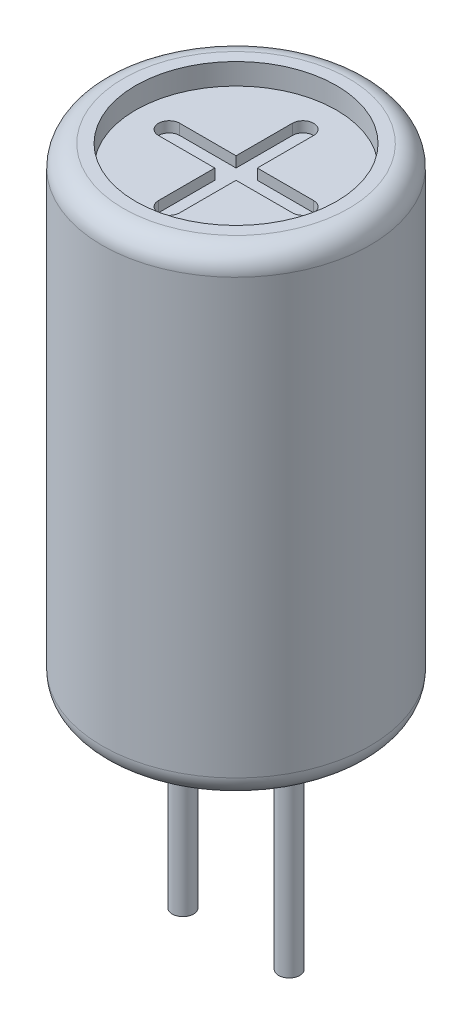
ISO-10303-21;
HEADER;
FILE_DESCRIPTION(('STEP AP214'),'2;1');
FILE_NAME('part.step','',(''),(''),'','','');
FILE_SCHEMA(('AUTOMOTIVE_DESIGN { 1 0 10303 214 1 1 1 1 }'));
ENDSEC;
DATA;
#1=APPLICATION_CONTEXT('core data for automotive mechanical design processes');
#2=APPLICATION_PROTOCOL_DEFINITION('international standard','automotive_design',2000,#1);
#3=PRODUCT_CONTEXT('',#1,'mechanical');
#4=PRODUCT('Part','Part','',(#3));
#5=PRODUCT_RELATED_PRODUCT_CATEGORY('part','',(#4));
#6=PRODUCT_DEFINITION_FORMATION('','',#4);
#7=PRODUCT_DEFINITION_CONTEXT('part definition',#1,'design');
#8=PRODUCT_DEFINITION('design','',#6,#7);
#9=PRODUCT_DEFINITION_SHAPE('','',#8);
#10=(LENGTH_UNIT() NAMED_UNIT(*) SI_UNIT(.MILLI.,.METRE.));
#11=(NAMED_UNIT(*) PLANE_ANGLE_UNIT() SI_UNIT($,.RADIAN.));
#12=(NAMED_UNIT(*) SI_UNIT($,.STERADIAN.) SOLID_ANGLE_UNIT());
#13=UNCERTAINTY_MEASURE_WITH_UNIT(LENGTH_MEASURE(1.E-05),#10,'distance_accuracy_value','');
#14=(GEOMETRIC_REPRESENTATION_CONTEXT(3) GLOBAL_UNCERTAINTY_ASSIGNED_CONTEXT((#13)) GLOBAL_UNIT_ASSIGNED_CONTEXT((#10,
#11,#12)) REPRESENTATION_CONTEXT('',''));
#15=CARTESIAN_POINT('',(0.,0.,0.));
#16=DIRECTION('',(0.,0.,1.));
#17=DIRECTION('',(1.,0.,0.));
#18=AXIS2_PLACEMENT_3D('',#15,#16,#17);
#19=CARTESIAN_POINT('',(-1.575,10.45,-0.250000000000001));
#20=DIRECTION('',(0.,0.,-1.));
#21=DIRECTION('',(-1.,0.,0.));
#22=AXIS2_PLACEMENT_3D('',#19,#20,#21);
#23=PLANE('',#22);
#24=DIRECTION('',(-1.,0.,0.));
#25=VECTOR('',#24,1.);
#26=CARTESIAN_POINT('',(-1.575,10.45,-0.250000000000001));
#27=LINE('',#26,#25);
#28=CARTESIAN_POINT('',(-0.250000000000001,10.45,-0.250000000000001));
#29=VERTEX_POINT('',#28);
#30=CARTESIAN_POINT('',(-1.575,10.45,-0.250000000000001));
#31=VERTEX_POINT('',#30);
#32=EDGE_CURVE('E213',#29,#31,#27,.T.);
#33=ORIENTED_EDGE('',*,*,#32,.F.);
#34=DIRECTION('',(0.,1.,0.));
#35=VECTOR('',#34,1.);
#36=CARTESIAN_POINT('',(-0.250000000000001,10.45,-0.250000000000001));
#37=LINE('',#36,#35);
#38=CARTESIAN_POINT('',(-0.250000000000001,10.7,-0.250000000000001));
#39=VERTEX_POINT('',#38);
#40=EDGE_CURVE('E195',#29,#39,#37,.T.);
#41=ORIENTED_EDGE('',*,*,#40,.T.);
#42=DIRECTION('',(-1.,0.,0.));
#43=VECTOR('',#42,1.);
#44=CARTESIAN_POINT('',(-1.575,10.7,-0.250000000000001));
#45=LINE('',#44,#43);
#46=CARTESIAN_POINT('',(-1.575,10.7,-0.250000000000001));
#47=VERTEX_POINT('',#46);
#48=EDGE_CURVE('E229',#39,#47,#45,.T.);
#49=ORIENTED_EDGE('',*,*,#48,.T.);
#50=DIRECTION('',(0.,1.,0.));
#51=VECTOR('',#50,1.);
#52=CARTESIAN_POINT('',(-1.575,10.45,-0.250000000000001));
#53=LINE('',#52,#51);
#54=EDGE_CURVE('E233',#31,#47,#53,.T.);
#55=ORIENTED_EDGE('',*,*,#54,.F.);
#56=EDGE_LOOP('',(#33,#41,#49,#55));
#57=FACE_BOUND('',#56,.T.);
#58=ADVANCED_FACE('F39',(#57),#23,.F.);
#59=CARTESIAN_POINT('',(-1.575,10.45,0.250000000000001));
#60=DIRECTION('',(0.,0.,1.));
#61=DIRECTION('',(1.,0.,0.));
#62=AXIS2_PLACEMENT_3D('',#59,#60,#61);
#63=PLANE('',#62);
#64=DIRECTION('',(1.,0.,0.));
#65=VECTOR('',#64,1.);
#66=CARTESIAN_POINT('',(-1.575,10.7,0.250000000000001));
#67=LINE('',#66,#65);
#68=CARTESIAN_POINT('',(-1.575,10.7,0.250000000000001));
#69=VERTEX_POINT('',#68);
#70=CARTESIAN_POINT('',(-0.250000000000001,10.7,0.25));
#71=VERTEX_POINT('',#70);
#72=EDGE_CURVE('E221',#69,#71,#67,.T.);
#73=ORIENTED_EDGE('',*,*,#72,.T.);
#74=DIRECTION('',(0.,-1.,0.));
#75=VECTOR('',#74,1.);
#76=CARTESIAN_POINT('',(-0.250000000000001,10.45,0.25));
#77=LINE('',#76,#75);
#78=CARTESIAN_POINT('',(-0.250000000000001,10.45,0.250000000000001));
#79=VERTEX_POINT('',#78);
#80=EDGE_CURVE('E191',#71,#79,#77,.T.);
#81=ORIENTED_EDGE('',*,*,#80,.T.);
#82=DIRECTION('',(1.,0.,0.));
#83=VECTOR('',#82,1.);
#84=CARTESIAN_POINT('',(-1.575,10.45,0.250000000000001));
#85=LINE('',#84,#83);
#86=CARTESIAN_POINT('',(-1.575,10.45,0.250000000000001));
#87=VERTEX_POINT('',#86);
#88=EDGE_CURVE('E206',#87,#79,#85,.T.);
#89=ORIENTED_EDGE('',*,*,#88,.F.);
#90=DIRECTION('',(0.,1.,0.));
#91=VECTOR('',#90,1.);
#92=CARTESIAN_POINT('',(-1.575,10.45,0.250000000000001));
#93=LINE('',#92,#91);
#94=EDGE_CURVE('E217',#87,#69,#93,.T.);
#95=ORIENTED_EDGE('',*,*,#94,.T.);
#96=EDGE_LOOP('',(#73,#81,#89,#95));
#97=FACE_BOUND('',#96,.T.);
#98=ADVANCED_FACE('F300',(#97),#63,.F.);
#99=CARTESIAN_POINT('',(0.,11.2,0.));
#100=DIRECTION('',(0.,-1.,0.));
#101=DIRECTION('',(0.,0.,-1.));
#102=AXIS2_PLACEMENT_3D('',#99,#100,#101);
#103=CYLINDRICAL_SURFACE('',#102,3.15);
#104=CARTESIAN_POINT('',(0.,0.5,0.));
#105=DIRECTION('',(0.,1.,0.));
#106=DIRECTION('',(0.,0.,1.));
#107=AXIS2_PLACEMENT_3D('',#104,#105,#106);
#108=CIRCLE('',#107,3.15);
#109=CARTESIAN_POINT('',(0.,0.5,3.15));
#110=VERTEX_POINT('',#109);
#111=EDGE_CURVE('E267',#110,#110,#108,.T.);
#112=ORIENTED_EDGE('',*,*,#111,.T.);
#113=EDGE_LOOP('',(#112));
#114=FACE_BOUND('',#113,.T.);
#115=CARTESIAN_POINT('',(0.,10.7,0.));
#116=DIRECTION('',(0.,1.,0.));
#117=DIRECTION('',(0.,0.,1.));
#118=AXIS2_PLACEMENT_3D('',#115,#116,#117);
#119=CIRCLE('',#118,3.15);
#120=CARTESIAN_POINT('',(0.,10.7,3.15));
#121=VERTEX_POINT('',#120);
#122=EDGE_CURVE('E263',#121,#121,#119,.F.);
#123=ORIENTED_EDGE('',*,*,#122,.T.);
#124=EDGE_LOOP('',(#123));
#125=FACE_BOUND('',#124,.T.);
#126=ADVANCED_FACE('F297',(#114,#125),#103,.T.);
#127=CARTESIAN_POINT('',(0.,11.2,0.));
#128=DIRECTION('',(0.,1.,0.));
#129=DIRECTION('',(0.,0.,1.));
#130=AXIS2_PLACEMENT_3D('',#127,#128,#129);
#131=PLANE('',#130);
#132=CARTESIAN_POINT('',(0.,11.2,0.));
#133=DIRECTION('',(0.,1.,0.));
#134=DIRECTION('',(0.,0.,1.));
#135=AXIS2_PLACEMENT_3D('',#132,#133,#134);
#136=CIRCLE('',#135,2.3625);
#137=CARTESIAN_POINT('',(0.,11.2,2.3625));
#138=VERTEX_POINT('',#137);
#139=EDGE_CURVE('E251',#138,#138,#136,.T.);
#140=ORIENTED_EDGE('',*,*,#139,.F.);
#141=EDGE_LOOP('',(#140));
#142=FACE_BOUND('',#141,.T.);
#143=CARTESIAN_POINT('',(0.,11.2,0.));
#144=DIRECTION('',(0.,1.,0.));
#145=DIRECTION('',(0.,0.,1.));
#146=AXIS2_PLACEMENT_3D('',#143,#144,#145);
#147=CIRCLE('',#146,2.65);
#148=CARTESIAN_POINT('',(0.,11.2,2.65));
#149=VERTEX_POINT('',#148);
#150=EDGE_CURVE('E275',#149,#149,#147,.T.);
#151=ORIENTED_EDGE('',*,*,#150,.T.);
#152=EDGE_LOOP('',(#151));
#153=FACE_BOUND('',#152,.T.);
#154=ADVANCED_FACE('F288',(#142,#153),#131,.T.);
#155=CARTESIAN_POINT('',(0.,0.,0.));
#156=DIRECTION('',(0.,1.,0.));
#157=DIRECTION('',(0.,0.,1.));
#158=AXIS2_PLACEMENT_3D('',#155,#156,#157);
#159=PLANE('',#158);
#160=CARTESIAN_POINT('',(1.25,0.,0.));
#161=DIRECTION('',(0.,1.,0.));
#162=DIRECTION('',(0.,0.,1.));
#163=AXIS2_PLACEMENT_3D('',#160,#161,#162);
#164=CIRCLE('',#163,0.25);
#165=CARTESIAN_POINT('',(1.25,0.,0.25));
#166=VERTEX_POINT('',#165);
#167=EDGE_CURVE('E11',#166,#166,#164,.F.);
#168=ORIENTED_EDGE('',*,*,#167,.F.);
#169=EDGE_LOOP('',(#168));
#170=FACE_BOUND('',#169,.T.);
#171=CARTESIAN_POINT('',(-1.25,0.,0.));
#172=DIRECTION('',(0.,1.,0.));
#173=DIRECTION('',(0.,0.,1.));
#174=AXIS2_PLACEMENT_3D('',#171,#172,#173);
#175=CIRCLE('',#174,0.25);
#176=CARTESIAN_POINT('',(-1.25,0.,0.25));
#177=VERTEX_POINT('',#176);
#178=EDGE_CURVE('E48',#177,#177,#175,.F.);
#179=ORIENTED_EDGE('',*,*,#178,.F.);
#180=EDGE_LOOP('',(#179));
#181=FACE_BOUND('',#180,.T.);
#182=CARTESIAN_POINT('',(0.,0.,0.));
#183=DIRECTION('',(0.,1.,0.));
#184=DIRECTION('',(0.,0.,1.));
#185=AXIS2_PLACEMENT_3D('',#182,#183,#184);
#186=CIRCLE('',#185,2.65);
#187=CARTESIAN_POINT('',(0.,0.,2.65));
#188=VERTEX_POINT('',#187);
#189=EDGE_CURVE('E271',#188,#188,#186,.F.);
#190=ORIENTED_EDGE('',*,*,#189,.T.);
#191=EDGE_LOOP('',(#190));
#192=FACE_BOUND('',#191,.T.);
#193=ADVANCED_FACE('F284',(#170,#181,#192),#159,.F.);
#194=CARTESIAN_POINT('',(0.,0.5,0.));
#195=DIRECTION('',(0.,1.,0.));
#196=DIRECTION('',(0.,0.,1.));
#197=AXIS2_PLACEMENT_3D('',#194,#195,#196);
#198=TOROIDAL_SURFACE('',#197,2.65,0.5);
#199=ORIENTED_EDGE('',*,*,#189,.F.);
#200=EDGE_LOOP('',(#199));
#201=FACE_BOUND('',#200,.T.);
#202=ORIENTED_EDGE('',*,*,#111,.F.);
#203=EDGE_LOOP('',(#202));
#204=FACE_BOUND('',#203,.T.);
#205=ADVANCED_FACE('F287',(#201,#204),#198,.T.);
#206=CARTESIAN_POINT('',(0.,10.7,0.));
#207=DIRECTION('',(0.,1.,0.));
#208=DIRECTION('',(0.,0.,1.));
#209=AXIS2_PLACEMENT_3D('',#206,#207,#208);
#210=TOROIDAL_SURFACE('',#209,2.65,0.5);
#211=ORIENTED_EDGE('',*,*,#122,.F.);
#212=EDGE_LOOP('',(#211));
#213=FACE_BOUND('',#212,.T.);
#214=ORIENTED_EDGE('',*,*,#150,.F.);
#215=EDGE_LOOP('',(#214));
#216=FACE_BOUND('',#215,.T.);
#217=ADVANCED_FACE('F41',(#213,#216),#210,.T.);
#218=CARTESIAN_POINT('',(-1.25,-5.,0.));
#219=DIRECTION('',(0.,1.,0.));
#220=DIRECTION('',(0.,0.,1.));
#221=AXIS2_PLACEMENT_3D('',#218,#219,#220);
#222=CYLINDRICAL_SURFACE('',#221,0.25);
#223=CARTESIAN_POINT('',(-1.25,-5.,0.));
#224=DIRECTION('',(0.,-1.,0.));
#225=DIRECTION('',(0.,0.,-1.));
#226=AXIS2_PLACEMENT_3D('',#223,#224,#225);
#227=CIRCLE('',#226,0.25);
#228=CARTESIAN_POINT('',(-1.25,-5.,-0.25));
#229=VERTEX_POINT('',#228);
#230=EDGE_CURVE('E259',#229,#229,#227,.T.);
#231=ORIENTED_EDGE('',*,*,#230,.F.);
#232=EDGE_LOOP('',(#231));
#233=FACE_BOUND('',#232,.T.);
#234=ORIENTED_EDGE('',*,*,#178,.T.);
#235=EDGE_LOOP('',(#234));
#236=FACE_BOUND('',#235,.T.);
#237=ADVANCED_FACE('F282',(#233,#236),#222,.T.);
#238=CARTESIAN_POINT('',(-1.25,-5.,0.));
#239=DIRECTION('',(0.,-1.,0.));
#240=DIRECTION('',(0.,0.,-1.));
#241=AXIS2_PLACEMENT_3D('',#238,#239,#240);
#242=PLANE('',#241);
#243=ORIENTED_EDGE('',*,*,#230,.T.);
#244=EDGE_LOOP('',(#243));
#245=FACE_BOUND('',#244,.T.);
#246=ADVANCED_FACE('F505',(#245),#242,.T.);
#247=CARTESIAN_POINT('',(1.25,-5.,0.));
#248=DIRECTION('',(0.,1.,0.));
#249=DIRECTION('',(0.,0.,1.));
#250=AXIS2_PLACEMENT_3D('',#247,#248,#249);
#251=CYLINDRICAL_SURFACE('',#250,0.25);
#252=CARTESIAN_POINT('',(1.25,-5.,0.));
#253=DIRECTION('',(0.,-1.,0.));
#254=DIRECTION('',(0.,0.,-1.));
#255=AXIS2_PLACEMENT_3D('',#252,#253,#254);
#256=CIRCLE('',#255,0.25);
#257=CARTESIAN_POINT('',(1.25,-5.,-0.25));
#258=VERTEX_POINT('',#257);
#259=EDGE_CURVE('E255',#258,#258,#256,.T.);
#260=ORIENTED_EDGE('',*,*,#259,.F.);
#261=EDGE_LOOP('',(#260));
#262=FACE_BOUND('',#261,.T.);
#263=ORIENTED_EDGE('',*,*,#167,.T.);
#264=EDGE_LOOP('',(#263));
#265=FACE_BOUND('',#264,.T.);
#266=ADVANCED_FACE('F495',(#262,#265),#251,.T.);
#267=CARTESIAN_POINT('',(1.25,-5.,0.));
#268=DIRECTION('',(0.,-1.,0.));
#269=DIRECTION('',(0.,0.,-1.));
#270=AXIS2_PLACEMENT_3D('',#267,#268,#269);
#271=PLANE('',#270);
#272=ORIENTED_EDGE('',*,*,#259,.T.);
#273=EDGE_LOOP('',(#272));
#274=FACE_BOUND('',#273,.T.);
#275=ADVANCED_FACE('F478',(#274),#271,.T.);
#276=CARTESIAN_POINT('',(0.,10.2,0.));
#277=DIRECTION('',(0.,1.,0.));
#278=DIRECTION('',(0.,0.,1.));
#279=AXIS2_PLACEMENT_3D('',#276,#277,#278);
#280=CYLINDRICAL_SURFACE('',#279,2.3625);
#281=CARTESIAN_POINT('',(0.,10.7,0.));
#282=DIRECTION('',(0.,1.,0.));
#283=DIRECTION('',(0.,0.,1.));
#284=AXIS2_PLACEMENT_3D('',#281,#282,#283);
#285=CIRCLE('',#284,2.3625);
#286=CARTESIAN_POINT('',(0.,10.7,2.3625));
#287=VERTEX_POINT('',#286);
#288=EDGE_CURVE('E237',#287,#287,#285,.T.);
#289=ORIENTED_EDGE('',*,*,#288,.F.);
#290=EDGE_LOOP('',(#289));
#291=FACE_BOUND('',#290,.T.);
#292=ORIENTED_EDGE('',*,*,#139,.T.);
#293=EDGE_LOOP('',(#292));
#294=FACE_BOUND('',#293,.T.);
#295=ADVANCED_FACE('F450',(#291,#294),#280,.F.);
#296=CARTESIAN_POINT('',(0.,10.7,0.));
#297=DIRECTION('',(0.,1.,0.));
#298=DIRECTION('',(0.,0.,1.));
#299=AXIS2_PLACEMENT_3D('',#296,#297,#298);
#300=PLANE('',#299);
#301=DIRECTION('',(0.,0.,1.));
#302=VECTOR('',#301,1.);
#303=CARTESIAN_POINT('',(-0.250000000000001,10.7,1.575));
#304=LINE('',#303,#302);
#305=CARTESIAN_POINT('',(-0.250000000000001,10.7,1.575));
#306=VERTEX_POINT('',#305);
#307=EDGE_CURVE('E159',#71,#306,#304,.T.);
#308=ORIENTED_EDGE('',*,*,#307,.F.);
#309=ORIENTED_EDGE('',*,*,#72,.F.);
#310=CARTESIAN_POINT('',(-1.575,10.7,0.));
#311=DIRECTION('',(0.,1.,0.));
#312=DIRECTION('',(0.,0.,1.));
#313=AXIS2_PLACEMENT_3D('',#310,#311,#312);
#314=CIRCLE('',#313,0.250000000000001);
#315=EDGE_CURVE('E199',#47,#69,#314,.T.);
#316=ORIENTED_EDGE('',*,*,#315,.F.);
#317=ORIENTED_EDGE('',*,*,#48,.F.);
#318=CARTESIAN_POINT('',(-0.250000000000001,10.7,-1.575));
#319=VERTEX_POINT('',#318);
#320=EDGE_CURVE('E155',#319,#39,#304,.T.);
#321=ORIENTED_EDGE('',*,*,#320,.F.);
#322=CARTESIAN_POINT('',(0.,10.7,-1.575));
#323=DIRECTION('',(0.,1.,0.));
#324=DIRECTION('',(0.,0.,1.));
#325=AXIS2_PLACEMENT_3D('',#322,#323,#324);
#326=CIRCLE('',#325,0.250000000000001);
#327=CARTESIAN_POINT('',(0.25,10.7,-1.575));
#328=VERTEX_POINT('',#327);
#329=EDGE_CURVE('E172',#328,#319,#326,.T.);
#330=ORIENTED_EDGE('',*,*,#329,.F.);
#331=DIRECTION('',(0.,0.,-1.));
#332=VECTOR('',#331,1.);
#333=CARTESIAN_POINT('',(0.250000000000001,10.7,1.575));
#334=LINE('',#333,#332);
#335=CARTESIAN_POINT('',(0.25,10.7,-0.250000000000001));
#336=VERTEX_POINT('',#335);
#337=EDGE_CURVE('E168',#336,#328,#334,.T.);
#338=ORIENTED_EDGE('',*,*,#337,.F.);
#339=CARTESIAN_POINT('',(1.575,10.7,-0.250000000000001));
#340=VERTEX_POINT('',#339);
#341=EDGE_CURVE('E205',#340,#336,#45,.T.);
#342=ORIENTED_EDGE('',*,*,#341,.F.);
#343=CARTESIAN_POINT('',(1.575,10.7,0.));
#344=DIRECTION('',(0.,1.,0.));
#345=DIRECTION('',(0.,0.,1.));
#346=AXIS2_PLACEMENT_3D('',#343,#344,#345);
#347=CIRCLE('',#346,0.250000000000001);
#348=CARTESIAN_POINT('',(1.575,10.7,0.25));
#349=VERTEX_POINT('',#348);
#350=EDGE_CURVE('E225',#349,#340,#347,.T.);
#351=ORIENTED_EDGE('',*,*,#350,.F.);
#352=CARTESIAN_POINT('',(0.25,10.7,0.25));
#353=VERTEX_POINT('',#352);
#354=EDGE_CURVE('E220',#353,#349,#67,.T.);
#355=ORIENTED_EDGE('',*,*,#354,.F.);
#356=CARTESIAN_POINT('',(0.250000000000001,10.7,1.575));
#357=VERTEX_POINT('',#356);
#358=EDGE_CURVE('E169',#357,#353,#334,.T.);
#359=ORIENTED_EDGE('',*,*,#358,.F.);
#360=CARTESIAN_POINT('',(0.,10.7,1.575));
#361=DIRECTION('',(0.,1.,0.));
#362=DIRECTION('',(0.,0.,1.));
#363=AXIS2_PLACEMENT_3D('',#360,#361,#362);
#364=CIRCLE('',#363,0.250000000000001);
#365=EDGE_CURVE('E135',#306,#357,#364,.T.);
#366=ORIENTED_EDGE('',*,*,#365,.F.);
#367=EDGE_LOOP('',(#308,#309,#316,#317,#321,#330,#338,#342,#351,#355,#359,#366));
#368=FACE_BOUND('',#367,.T.);
#369=ORIENTED_EDGE('',*,*,#288,.T.);
#370=EDGE_LOOP('',(#369));
#371=FACE_BOUND('',#370,.T.);
#372=ADVANCED_FACE('F337',(#368,#371),#300,.T.);
#373=CARTESIAN_POINT('',(-1.575,10.45,0.));
#374=DIRECTION('',(0.,1.,0.));
#375=DIRECTION('',(0.,0.,1.));
#376=AXIS2_PLACEMENT_3D('',#373,#374,#375);
#377=CYLINDRICAL_SURFACE('',#376,0.250000000000001);
#378=ORIENTED_EDGE('',*,*,#315,.T.);
#379=ORIENTED_EDGE('',*,*,#94,.F.);
#380=CARTESIAN_POINT('',(-1.575,10.45,0.));
#381=DIRECTION('',(0.,1.,0.));
#382=DIRECTION('',(0.,0.,1.));
#383=AXIS2_PLACEMENT_3D('',#380,#381,#382);
#384=CIRCLE('',#383,0.250000000000001);
#385=EDGE_CURVE('E200',#31,#87,#384,.T.);
#386=ORIENTED_EDGE('',*,*,#385,.F.);
#387=ORIENTED_EDGE('',*,*,#54,.T.);
#388=EDGE_LOOP('',(#378,#379,#386,#387));
#389=FACE_BOUND('',#388,.T.);
#390=ADVANCED_FACE('F330',(#389),#377,.F.);
#391=ORIENTED_EDGE('',*,*,#341,.T.);
#392=DIRECTION('',(0.,-1.,0.));
#393=VECTOR('',#392,1.);
#394=CARTESIAN_POINT('',(0.25,10.45,-0.250000000000001));
#395=LINE('',#394,#393);
#396=CARTESIAN_POINT('',(0.25,10.45,-0.250000000000001));
#397=VERTEX_POINT('',#396);
#398=EDGE_CURVE('E187',#336,#397,#395,.T.);
#399=ORIENTED_EDGE('',*,*,#398,.T.);
#400=CARTESIAN_POINT('',(1.575,10.45,-0.250000000000001));
#401=VERTEX_POINT('',#400);
#402=EDGE_CURVE('E214',#401,#397,#27,.T.);
#403=ORIENTED_EDGE('',*,*,#402,.F.);
#404=DIRECTION('',(0.,1.,0.));
#405=VECTOR('',#404,1.);
#406=CARTESIAN_POINT('',(1.575,10.45,-0.250000000000001));
#407=LINE('',#406,#405);
#408=EDGE_CURVE('E238',#401,#340,#407,.T.);
#409=ORIENTED_EDGE('',*,*,#408,.T.);
#410=EDGE_LOOP('',(#391,#399,#403,#409));
#411=FACE_BOUND('',#410,.T.);
#412=ADVANCED_FACE('F318',(#411),#23,.F.);
#413=CARTESIAN_POINT('',(1.575,10.45,0.));
#414=DIRECTION('',(0.,1.,0.));
#415=DIRECTION('',(0.,0.,1.));
#416=AXIS2_PLACEMENT_3D('',#413,#414,#415);
#417=CYLINDRICAL_SURFACE('',#416,0.250000000000001);
#418=ORIENTED_EDGE('',*,*,#350,.T.);
#419=ORIENTED_EDGE('',*,*,#408,.F.);
#420=CARTESIAN_POINT('',(1.575,10.45,0.));
#421=DIRECTION('',(0.,1.,0.));
#422=DIRECTION('',(0.,0.,1.));
#423=AXIS2_PLACEMENT_3D('',#420,#421,#422);
#424=CIRCLE('',#423,0.250000000000001);
#425=CARTESIAN_POINT('',(1.575,10.45,0.25));
#426=VERTEX_POINT('',#425);
#427=EDGE_CURVE('E209',#426,#401,#424,.T.);
#428=ORIENTED_EDGE('',*,*,#427,.F.);
#429=DIRECTION('',(0.,1.,0.));
#430=VECTOR('',#429,1.);
#431=CARTESIAN_POINT('',(1.575,10.45,0.25));
#432=LINE('',#431,#430);
#433=EDGE_CURVE('E241',#426,#349,#432,.T.);
#434=ORIENTED_EDGE('',*,*,#433,.T.);
#435=EDGE_LOOP('',(#418,#419,#428,#434));
#436=FACE_BOUND('',#435,.T.);
#437=ADVANCED_FACE('F329',(#436),#417,.F.);
#438=CARTESIAN_POINT('',(0.25,10.45,0.25));
#439=VERTEX_POINT('',#438);
#440=EDGE_CURVE('E204',#439,#426,#85,.T.);
#441=ORIENTED_EDGE('',*,*,#440,.F.);
#442=DIRECTION('',(0.,1.,0.));
#443=VECTOR('',#442,1.);
#444=CARTESIAN_POINT('',(0.25,10.45,0.25));
#445=LINE('',#444,#443);
#446=EDGE_CURVE('E143',#439,#353,#445,.T.);
#447=ORIENTED_EDGE('',*,*,#446,.T.);
#448=ORIENTED_EDGE('',*,*,#354,.T.);
#449=ORIENTED_EDGE('',*,*,#433,.F.);
#450=EDGE_LOOP('',(#441,#447,#448,#449));
#451=FACE_BOUND('',#450,.T.);
#452=ADVANCED_FACE('F324',(#451),#63,.F.);
#453=CARTESIAN_POINT('',(-1.575,10.45,0.));
#454=DIRECTION('',(0.,1.,0.));
#455=DIRECTION('',(0.,0.,1.));
#456=AXIS2_PLACEMENT_3D('',#453,#454,#455);
#457=PLANE('',#456);
#458=ORIENTED_EDGE('',*,*,#402,.T.);
#459=DIRECTION('',(0.,0.,-1.));
#460=VECTOR('',#459,1.);
#461=CARTESIAN_POINT('',(0.250000000000001,10.45,1.575));
#462=LINE('',#461,#460);
#463=CARTESIAN_POINT('',(0.25,10.45,-1.575));
#464=VERTEX_POINT('',#463);
#465=EDGE_CURVE('E147',#397,#464,#462,.T.);
#466=ORIENTED_EDGE('',*,*,#465,.T.);
#467=CARTESIAN_POINT('',(0.,10.45,-1.575));
#468=DIRECTION('',(0.,1.,0.));
#469=DIRECTION('',(0.,0.,1.));
#470=AXIS2_PLACEMENT_3D('',#467,#468,#469);
#471=CIRCLE('',#470,0.250000000000001);
#472=CARTESIAN_POINT('',(-0.250000000000001,10.45,-1.575));
#473=VERTEX_POINT('',#472);
#474=EDGE_CURVE('E146',#464,#473,#471,.T.);
#475=ORIENTED_EDGE('',*,*,#474,.T.);
#476=DIRECTION('',(0.,0.,1.));
#477=VECTOR('',#476,1.);
#478=CARTESIAN_POINT('',(-0.250000000000001,10.45,1.575));
#479=LINE('',#478,#477);
#480=EDGE_CURVE('E55',#473,#29,#479,.T.);
#481=ORIENTED_EDGE('',*,*,#480,.T.);
#482=ORIENTED_EDGE('',*,*,#32,.T.);
#483=ORIENTED_EDGE('',*,*,#385,.T.);
#484=ORIENTED_EDGE('',*,*,#88,.T.);
#485=CARTESIAN_POINT('',(-0.250000000000001,10.45,1.575));
#486=VERTEX_POINT('',#485);
#487=EDGE_CURVE('E152',#79,#486,#479,.T.);
#488=ORIENTED_EDGE('',*,*,#487,.T.);
#489=CARTESIAN_POINT('',(0.,10.45,1.575));
#490=DIRECTION('',(0.,1.,0.));
#491=DIRECTION('',(0.,0.,1.));
#492=AXIS2_PLACEMENT_3D('',#489,#490,#491);
#493=CIRCLE('',#492,0.250000000000001);
#494=CARTESIAN_POINT('',(0.250000000000001,10.45,1.575));
#495=VERTEX_POINT('',#494);
#496=EDGE_CURVE('E133',#486,#495,#493,.T.);
#497=ORIENTED_EDGE('',*,*,#496,.T.);
#498=EDGE_CURVE('E62',#495,#439,#462,.T.);
#499=ORIENTED_EDGE('',*,*,#498,.T.);
#500=ORIENTED_EDGE('',*,*,#440,.T.);
#501=ORIENTED_EDGE('',*,*,#427,.T.);
#502=EDGE_LOOP('',(#458,#466,#475,#481,#482,#483,#484,#488,#497,#499,#500,#501));
#503=FACE_BOUND('',#502,.T.);
#504=ADVANCED_FACE('F150',(#503),#457,.T.);
#505=CARTESIAN_POINT('',(0.250000000000001,10.45,1.575));
#506=DIRECTION('',(1.,0.,0.));
#507=DIRECTION('',(0.,0.,-1.));
#508=AXIS2_PLACEMENT_3D('',#505,#506,#507);
#509=PLANE('',#508);
#510=ORIENTED_EDGE('',*,*,#498,.F.);
#511=DIRECTION('',(0.,1.,0.));
#512=VECTOR('',#511,1.);
#513=CARTESIAN_POINT('',(0.250000000000001,10.45,1.575));
#514=LINE('',#513,#512);
#515=EDGE_CURVE('E130',#495,#357,#514,.T.);
#516=ORIENTED_EDGE('',*,*,#515,.T.);
#517=ORIENTED_EDGE('',*,*,#358,.T.);
#518=ORIENTED_EDGE('',*,*,#446,.F.);
#519=EDGE_LOOP('',(#510,#516,#517,#518));
#520=FACE_BOUND('',#519,.T.);
#521=ADVANCED_FACE('F141',(#520),#509,.F.);
#522=CARTESIAN_POINT('',(-0.250000000000001,10.45,1.575));
#523=DIRECTION('',(-1.,0.,0.));
#524=DIRECTION('',(0.,0.,1.));
#525=AXIS2_PLACEMENT_3D('',#522,#523,#524);
#526=PLANE('',#525);
#527=ORIENTED_EDGE('',*,*,#307,.T.);
#528=DIRECTION('',(0.,1.,0.));
#529=VECTOR('',#528,1.);
#530=CARTESIAN_POINT('',(-0.250000000000001,10.45,1.575));
#531=LINE('',#530,#529);
#532=EDGE_CURVE('E176',#486,#306,#531,.T.);
#533=ORIENTED_EDGE('',*,*,#532,.F.);
#534=ORIENTED_EDGE('',*,*,#487,.F.);
#535=ORIENTED_EDGE('',*,*,#80,.F.);
#536=EDGE_LOOP('',(#527,#533,#534,#535));
#537=FACE_BOUND('',#536,.T.);
#538=ADVANCED_FACE('F355',(#537),#526,.F.);
#539=CARTESIAN_POINT('',(0.,10.45,1.575));
#540=DIRECTION('',(0.,1.,0.));
#541=DIRECTION('',(0.,0.,1.));
#542=AXIS2_PLACEMENT_3D('',#539,#540,#541);
#543=CYLINDRICAL_SURFACE('',#542,0.250000000000001);
#544=ORIENTED_EDGE('',*,*,#365,.T.);
#545=ORIENTED_EDGE('',*,*,#515,.F.);
#546=ORIENTED_EDGE('',*,*,#496,.F.);
#547=ORIENTED_EDGE('',*,*,#532,.T.);
#548=EDGE_LOOP('',(#544,#545,#546,#547));
#549=FACE_BOUND('',#548,.T.);
#550=ADVANCED_FACE('F131',(#549),#543,.F.);
#551=ORIENTED_EDGE('',*,*,#480,.F.);
#552=DIRECTION('',(0.,1.,0.));
#553=VECTOR('',#552,1.);
#554=CARTESIAN_POINT('',(-0.250000000000001,10.45,-1.575));
#555=LINE('',#554,#553);
#556=EDGE_CURVE('E179',#473,#319,#555,.T.);
#557=ORIENTED_EDGE('',*,*,#556,.T.);
#558=ORIENTED_EDGE('',*,*,#320,.T.);
#559=ORIENTED_EDGE('',*,*,#40,.F.);
#560=EDGE_LOOP('',(#551,#557,#558,#559));
#561=FACE_BOUND('',#560,.T.);
#562=ADVANCED_FACE('F371',(#561),#526,.F.);
#563=ORIENTED_EDGE('',*,*,#337,.T.);
#564=DIRECTION('',(0.,1.,0.));
#565=VECTOR('',#564,1.);
#566=CARTESIAN_POINT('',(0.25,10.45,-1.575));
#567=LINE('',#566,#565);
#568=EDGE_CURVE('E139',#464,#328,#567,.T.);
#569=ORIENTED_EDGE('',*,*,#568,.F.);
#570=ORIENTED_EDGE('',*,*,#465,.F.);
#571=ORIENTED_EDGE('',*,*,#398,.F.);
#572=EDGE_LOOP('',(#563,#569,#570,#571));
#573=FACE_BOUND('',#572,.T.);
#574=ADVANCED_FACE('F375',(#573),#509,.F.);
#575=CARTESIAN_POINT('',(0.,10.45,-1.575));
#576=DIRECTION('',(0.,1.,0.));
#577=DIRECTION('',(0.,0.,1.));
#578=AXIS2_PLACEMENT_3D('',#575,#576,#577);
#579=CYLINDRICAL_SURFACE('',#578,0.250000000000001);
#580=ORIENTED_EDGE('',*,*,#329,.T.);
#581=ORIENTED_EDGE('',*,*,#556,.F.);
#582=ORIENTED_EDGE('',*,*,#474,.F.);
#583=ORIENTED_EDGE('',*,*,#568,.T.);
#584=EDGE_LOOP('',(#580,#581,#582,#583));
#585=FACE_BOUND('',#584,.T.);
#586=ADVANCED_FACE('F374',(#585),#579,.F.);
#587=CLOSED_SHELL('',(#58,#98,#126,#154,#193,#205,#217,#237,#246,#266,#275,#295,#372,#390,#412,
#437,#452,#504,#521,#538,#550,#562,#574,#586));
#588=MANIFOLD_SOLID_BREP('B2',#587);
#589=ADVANCED_BREP_SHAPE_REPRESENTATION('',(#18,#588),#14);
#590=SHAPE_DEFINITION_REPRESENTATION(#9,#589);
ENDSEC;
END-ISO-10303-21;
